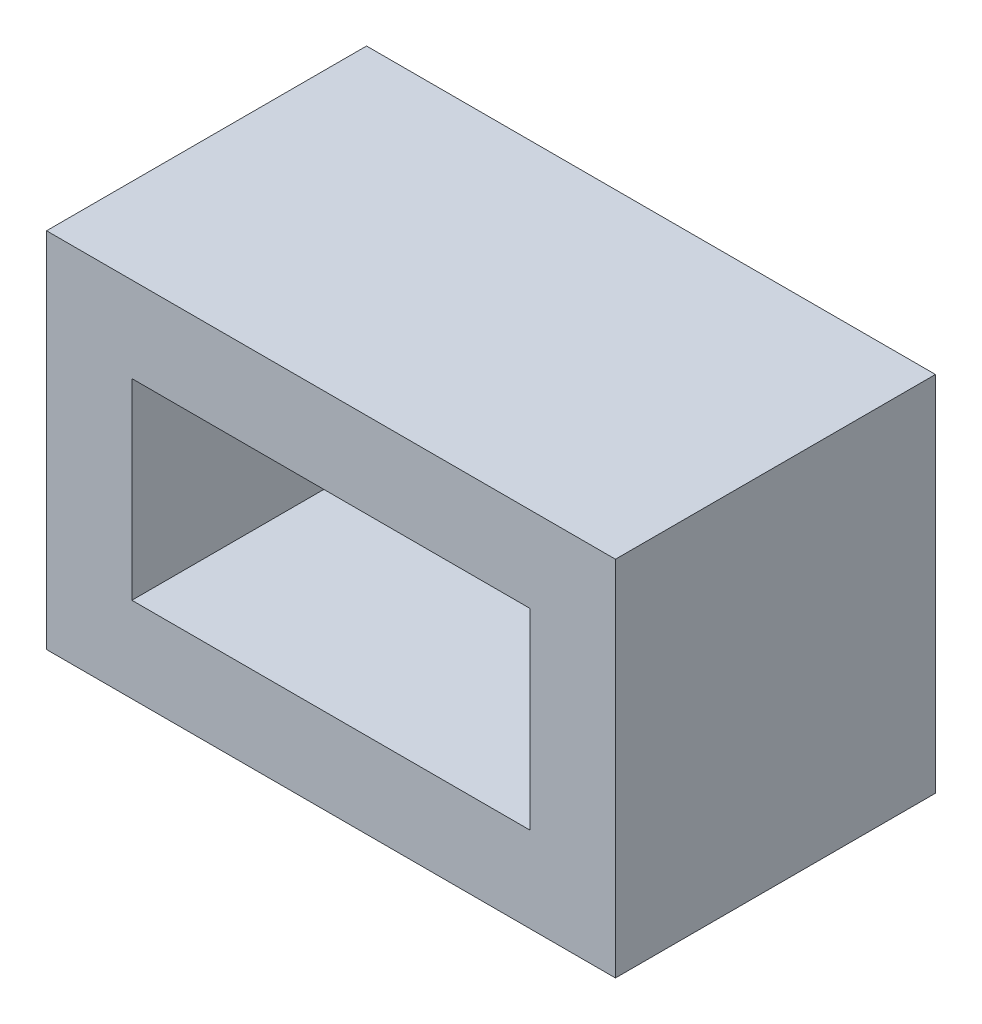
ISO-10303-21;
HEADER;
FILE_DESCRIPTION(('STEP AP214'),'2;1');
FILE_NAME('part.step','',(''),(''),'','','');
FILE_SCHEMA(('AUTOMOTIVE_DESIGN { 1 0 10303 214 1 1 1 1 }'));
ENDSEC;
DATA;
#1=APPLICATION_CONTEXT('core data for automotive mechanical design processes');
#2=APPLICATION_PROTOCOL_DEFINITION('international standard','automotive_design',2000,#1);
#3=PRODUCT_CONTEXT('',#1,'mechanical');
#4=PRODUCT('Part','Part','',(#3));
#5=PRODUCT_RELATED_PRODUCT_CATEGORY('part','',(#4));
#6=PRODUCT_DEFINITION_FORMATION('','',#4);
#7=PRODUCT_DEFINITION_CONTEXT('part definition',#1,'design');
#8=PRODUCT_DEFINITION('design','',#6,#7);
#9=PRODUCT_DEFINITION_SHAPE('','',#8);
#10=(LENGTH_UNIT() NAMED_UNIT(*) SI_UNIT(.MILLI.,.METRE.));
#11=(NAMED_UNIT(*) PLANE_ANGLE_UNIT() SI_UNIT($,.RADIAN.));
#12=(NAMED_UNIT(*) SI_UNIT($,.STERADIAN.) SOLID_ANGLE_UNIT());
#13=UNCERTAINTY_MEASURE_WITH_UNIT(LENGTH_MEASURE(1.E-05),#10,'distance_accuracy_value','');
#14=(GEOMETRIC_REPRESENTATION_CONTEXT(3) GLOBAL_UNCERTAINTY_ASSIGNED_CONTEXT((#13)) GLOBAL_UNIT_ASSIGNED_CONTEXT((#10,
#11,#12)) REPRESENTATION_CONTEXT('',''));
#15=CARTESIAN_POINT('',(0.,0.,0.));
#16=DIRECTION('',(0.,0.,1.));
#17=DIRECTION('',(1.,0.,0.));
#18=AXIS2_PLACEMENT_3D('',#15,#16,#17);
#19=CARTESIAN_POINT('',(21.,1.65924554587383,-37.));
#20=DIRECTION('',(0.,0.,1.));
#21=DIRECTION('',(1.,0.,0.));
#22=AXIS2_PLACEMENT_3D('',#19,#20,#21);
#23=PLANE('',#22);
#24=DIRECTION('',(0.,1.,0.));
#25=VECTOR('',#24,1.);
#26=CARTESIAN_POINT('',(18.2,0.309245545873832,-37.));
#27=LINE('',#26,#25);
#28=CARTESIAN_POINT('',(18.2,0.309245545873832,-37.));
#29=VERTEX_POINT('',#28);
#30=CARTESIAN_POINT('',(18.2,3.00924554587383,-37.));
#31=VERTEX_POINT('',#30);
#32=EDGE_CURVE('E165',#29,#31,#27,.T.);
#33=ORIENTED_EDGE('',*,*,#32,.T.);
#34=DIRECTION('',(1.,0.,0.));
#35=VECTOR('',#34,1.);
#36=CARTESIAN_POINT('',(23.8,3.00924554587383,-37.));
#37=LINE('',#36,#35);
#38=CARTESIAN_POINT('',(23.8,3.00924554587383,-37.));
#39=VERTEX_POINT('',#38);
#40=EDGE_CURVE('E175',#31,#39,#37,.T.);
#41=ORIENTED_EDGE('',*,*,#40,.T.);
#42=DIRECTION('',(0.,-1.,0.));
#43=VECTOR('',#42,1.);
#44=CARTESIAN_POINT('',(23.8,0.309245545873832,-37.));
#45=LINE('',#44,#43);
#46=CARTESIAN_POINT('',(23.8,0.309245545873832,-37.));
#47=VERTEX_POINT('',#46);
#48=EDGE_CURVE('E176',#39,#47,#45,.T.);
#49=ORIENTED_EDGE('',*,*,#48,.T.);
#50=DIRECTION('',(-1.,0.,0.));
#51=VECTOR('',#50,1.);
#52=CARTESIAN_POINT('',(18.2,0.309245545873832,-37.));
#53=LINE('',#52,#51);
#54=EDGE_CURVE('E135',#47,#29,#53,.T.);
#55=ORIENTED_EDGE('',*,*,#54,.T.);
#56=EDGE_LOOP('',(#33,#41,#49,#55));
#57=FACE_BOUND('',#56,.T.);
#58=DIRECTION('',(0.,-1.,0.));
#59=VECTOR('',#58,1.);
#60=CARTESIAN_POINT('',(17.,-0.890754454126168,-37.));
#61=LINE('',#60,#59);
#62=CARTESIAN_POINT('',(17.,4.20924554587383,-37.));
#63=VERTEX_POINT('',#62);
#64=CARTESIAN_POINT('',(17.,-0.890754454126168,-37.));
#65=VERTEX_POINT('',#64);
#66=EDGE_CURVE('E181',#63,#65,#61,.T.);
#67=ORIENTED_EDGE('',*,*,#66,.T.);
#68=DIRECTION('',(1.,0.,0.));
#69=VECTOR('',#68,1.);
#70=CARTESIAN_POINT('',(17.,-0.890754454126168,-37.));
#71=LINE('',#70,#69);
#72=CARTESIAN_POINT('',(25.,-0.890754454126168,-37.));
#73=VERTEX_POINT('',#72);
#74=EDGE_CURVE('E11',#65,#73,#71,.T.);
#75=ORIENTED_EDGE('',*,*,#74,.T.);
#76=DIRECTION('',(0.,1.,0.));
#77=VECTOR('',#76,1.);
#78=CARTESIAN_POINT('',(25.,-0.890754454126168,-37.));
#79=LINE('',#78,#77);
#80=CARTESIAN_POINT('',(25.,4.20924554587383,-37.));
#81=VERTEX_POINT('',#80);
#82=EDGE_CURVE('E179',#73,#81,#79,.T.);
#83=ORIENTED_EDGE('',*,*,#82,.T.);
#84=DIRECTION('',(-1.,0.,0.));
#85=VECTOR('',#84,1.);
#86=CARTESIAN_POINT('',(25.,4.20924554587383,-37.));
#87=LINE('',#86,#85);
#88=EDGE_CURVE('E164',#81,#63,#87,.T.);
#89=ORIENTED_EDGE('',*,*,#88,.T.);
#90=EDGE_LOOP('',(#67,#75,#83,#89));
#91=FACE_BOUND('',#90,.T.);
#92=ADVANCED_FACE('F17',(#57,#91),#23,.T.);
#93=CARTESIAN_POINT('',(17.,-0.890754454126168,-42.));
#94=DIRECTION('',(0.,-1.,0.));
#95=DIRECTION('',(0.,0.,-1.));
#96=AXIS2_PLACEMENT_3D('',#93,#94,#95);
#97=PLANE('',#96);
#98=DIRECTION('',(1.,0.,0.));
#99=VECTOR('',#98,1.);
#100=CARTESIAN_POINT('',(19.,-0.890754454126168,-41.5));
#101=LINE('',#100,#99);
#102=CARTESIAN_POINT('',(17.,-0.890754454126168,-41.5));
#103=VERTEX_POINT('',#102);
#104=CARTESIAN_POINT('',(25.,-0.890754454126168,-41.5));
#105=VERTEX_POINT('',#104);
#106=EDGE_CURVE('E158',#103,#105,#101,.T.);
#107=ORIENTED_EDGE('',*,*,#106,.T.);
#108=DIRECTION('',(0.,0.,1.));
#109=VECTOR('',#108,1.);
#110=CARTESIAN_POINT('',(25.,-0.890754454126168,-42.));
#111=LINE('',#110,#109);
#112=EDGE_CURVE('E28',#105,#73,#111,.T.);
#113=ORIENTED_EDGE('',*,*,#112,.T.);
#114=ORIENTED_EDGE('',*,*,#74,.F.);
#115=DIRECTION('',(0.,0.,1.));
#116=VECTOR('',#115,1.);
#117=CARTESIAN_POINT('',(17.,-0.890754454126168,-42.));
#118=LINE('',#117,#116);
#119=EDGE_CURVE('E21',#103,#65,#118,.T.);
#120=ORIENTED_EDGE('',*,*,#119,.F.);
#121=EDGE_LOOP('',(#107,#113,#114,#120));
#122=FACE_BOUND('',#121,.T.);
#123=ADVANCED_FACE('F233',(#122),#97,.T.);
#124=CARTESIAN_POINT('',(25.,-0.890754454126168,-42.));
#125=DIRECTION('',(1.,0.,0.));
#126=DIRECTION('',(0.,1.,0.));
#127=AXIS2_PLACEMENT_3D('',#124,#125,#126);
#128=PLANE('',#127);
#129=DIRECTION('',(0.,1.,0.));
#130=VECTOR('',#129,1.);
#131=CARTESIAN_POINT('',(25.,0.384245545873832,-41.5));
#132=LINE('',#131,#130);
#133=CARTESIAN_POINT('',(25.,4.20924554587383,-41.5));
#134=VERTEX_POINT('',#133);
#135=EDGE_CURVE('E169',#105,#134,#132,.T.);
#136=ORIENTED_EDGE('',*,*,#135,.T.);
#137=DIRECTION('',(0.,0.,1.));
#138=VECTOR('',#137,1.);
#139=CARTESIAN_POINT('',(25.,4.20924554587383,-42.));
#140=LINE('',#139,#138);
#141=EDGE_CURVE('E80',#134,#81,#140,.T.);
#142=ORIENTED_EDGE('',*,*,#141,.T.);
#143=ORIENTED_EDGE('',*,*,#82,.F.);
#144=ORIENTED_EDGE('',*,*,#112,.F.);
#145=EDGE_LOOP('',(#136,#142,#143,#144));
#146=FACE_BOUND('',#145,.T.);
#147=ADVANCED_FACE('F223',(#146),#128,.T.);
#148=CARTESIAN_POINT('',(18.2,3.00924554587383,-42.));
#149=DIRECTION('',(0.,-1.,0.));
#150=DIRECTION('',(0.,0.,-1.));
#151=AXIS2_PLACEMENT_3D('',#148,#149,#150);
#152=PLANE('',#151);
#153=DIRECTION('',(1.,0.,0.));
#154=VECTOR('',#153,1.);
#155=CARTESIAN_POINT('',(19.6,3.00924554587383,-41.5));
#156=LINE('',#155,#154);
#157=CARTESIAN_POINT('',(18.2,3.00924554587383,-41.5));
#158=VERTEX_POINT('',#157);
#159=CARTESIAN_POINT('',(23.8,3.00924554587383,-41.5));
#160=VERTEX_POINT('',#159);
#161=EDGE_CURVE('E147',#158,#160,#156,.T.);
#162=ORIENTED_EDGE('',*,*,#161,.T.);
#163=DIRECTION('',(0.,0.,1.));
#164=VECTOR('',#163,1.);
#165=CARTESIAN_POINT('',(23.8,3.00924554587383,-42.));
#166=LINE('',#165,#164);
#167=EDGE_CURVE('E144',#160,#39,#166,.T.);
#168=ORIENTED_EDGE('',*,*,#167,.T.);
#169=ORIENTED_EDGE('',*,*,#40,.F.);
#170=DIRECTION('',(0.,0.,1.));
#171=VECTOR('',#170,1.);
#172=CARTESIAN_POINT('',(18.2,3.00924554587383,-42.));
#173=LINE('',#172,#171);
#174=EDGE_CURVE('E120',#158,#31,#173,.T.);
#175=ORIENTED_EDGE('',*,*,#174,.F.);
#176=EDGE_LOOP('',(#162,#168,#169,#175));
#177=FACE_BOUND('',#176,.T.);
#178=ADVANCED_FACE('F221',(#177),#152,.T.);
#179=CARTESIAN_POINT('',(23.8,3.00924554587383,-42.));
#180=DIRECTION('',(-1.,0.,0.));
#181=DIRECTION('',(0.,0.,1.));
#182=AXIS2_PLACEMENT_3D('',#179,#180,#181);
#183=PLANE('',#182);
#184=DIRECTION('',(0.,-1.,0.));
#185=VECTOR('',#184,1.);
#186=CARTESIAN_POINT('',(23.8,2.33424554587383,-41.5));
#187=LINE('',#186,#185);
#188=CARTESIAN_POINT('',(23.8,0.309245545873832,-41.5));
#189=VERTEX_POINT('',#188);
#190=EDGE_CURVE('E141',#160,#189,#187,.T.);
#191=ORIENTED_EDGE('',*,*,#190,.T.);
#192=DIRECTION('',(0.,0.,1.));
#193=VECTOR('',#192,1.);
#194=CARTESIAN_POINT('',(23.8,0.309245545873832,-42.));
#195=LINE('',#194,#193);
#196=EDGE_CURVE('E128',#189,#47,#195,.T.);
#197=ORIENTED_EDGE('',*,*,#196,.T.);
#198=ORIENTED_EDGE('',*,*,#48,.F.);
#199=ORIENTED_EDGE('',*,*,#167,.F.);
#200=EDGE_LOOP('',(#191,#197,#198,#199));
#201=FACE_BOUND('',#200,.T.);
#202=ADVANCED_FACE('F142',(#201),#183,.T.);
#203=CARTESIAN_POINT('',(17.,4.20924554587383,-42.));
#204=DIRECTION('',(-1.,0.,0.));
#205=DIRECTION('',(0.,0.,1.));
#206=AXIS2_PLACEMENT_3D('',#203,#204,#205);
#207=PLANE('',#206);
#208=DIRECTION('',(0.,-1.,0.));
#209=VECTOR('',#208,1.);
#210=CARTESIAN_POINT('',(17.,2.93424554587383,-41.5));
#211=LINE('',#210,#209);
#212=CARTESIAN_POINT('',(17.,4.20924554587383,-41.5));
#213=VERTEX_POINT('',#212);
#214=EDGE_CURVE('E204',#213,#103,#211,.T.);
#215=ORIENTED_EDGE('',*,*,#214,.T.);
#216=ORIENTED_EDGE('',*,*,#119,.T.);
#217=ORIENTED_EDGE('',*,*,#66,.F.);
#218=DIRECTION('',(0.,0.,1.));
#219=VECTOR('',#218,1.);
#220=CARTESIAN_POINT('',(17.,4.20924554587383,-42.));
#221=LINE('',#220,#219);
#222=EDGE_CURVE('E60',#213,#63,#221,.T.);
#223=ORIENTED_EDGE('',*,*,#222,.F.);
#224=EDGE_LOOP('',(#215,#216,#217,#223));
#225=FACE_BOUND('',#224,.T.);
#226=ADVANCED_FACE('F231',(#225),#207,.T.);
#227=CARTESIAN_POINT('',(25.,4.20924554587383,-42.));
#228=DIRECTION('',(0.,1.,0.));
#229=DIRECTION('',(1.,0.,0.));
#230=AXIS2_PLACEMENT_3D('',#227,#228,#229);
#231=PLANE('',#230);
#232=DIRECTION('',(-1.,0.,0.));
#233=VECTOR('',#232,1.);
#234=CARTESIAN_POINT('',(23.,4.20924554587383,-41.5));
#235=LINE('',#234,#233);
#236=EDGE_CURVE('E172',#134,#213,#235,.T.);
#237=ORIENTED_EDGE('',*,*,#236,.T.);
#238=ORIENTED_EDGE('',*,*,#222,.T.);
#239=ORIENTED_EDGE('',*,*,#88,.F.);
#240=ORIENTED_EDGE('',*,*,#141,.F.);
#241=EDGE_LOOP('',(#237,#238,#239,#240));
#242=FACE_BOUND('',#241,.T.);
#243=ADVANCED_FACE('F19',(#242),#231,.T.);
#244=CARTESIAN_POINT('',(18.2,0.309245545873832,-42.));
#245=DIRECTION('',(1.,0.,0.));
#246=DIRECTION('',(0.,1.,0.));
#247=AXIS2_PLACEMENT_3D('',#244,#245,#246);
#248=PLANE('',#247);
#249=DIRECTION('',(0.,1.,0.));
#250=VECTOR('',#249,1.);
#251=CARTESIAN_POINT('',(18.2,0.984245545873832,-41.5));
#252=LINE('',#251,#250);
#253=CARTESIAN_POINT('',(18.2,0.309245545873832,-41.5));
#254=VERTEX_POINT('',#253);
#255=EDGE_CURVE('E151',#254,#158,#252,.T.);
#256=ORIENTED_EDGE('',*,*,#255,.T.);
#257=ORIENTED_EDGE('',*,*,#174,.T.);
#258=ORIENTED_EDGE('',*,*,#32,.F.);
#259=DIRECTION('',(0.,0.,1.));
#260=VECTOR('',#259,1.);
#261=CARTESIAN_POINT('',(18.2,0.309245545873832,-42.));
#262=LINE('',#261,#260);
#263=EDGE_CURVE('E113',#254,#29,#262,.T.);
#264=ORIENTED_EDGE('',*,*,#263,.F.);
#265=EDGE_LOOP('',(#256,#257,#258,#264));
#266=FACE_BOUND('',#265,.T.);
#267=ADVANCED_FACE('F220',(#266),#248,.T.);
#268=CARTESIAN_POINT('',(23.8,0.309245545873832,-42.));
#269=DIRECTION('',(0.,1.,0.));
#270=DIRECTION('',(1.,0.,0.));
#271=AXIS2_PLACEMENT_3D('',#268,#269,#270);
#272=PLANE('',#271);
#273=DIRECTION('',(-1.,0.,0.));
#274=VECTOR('',#273,1.);
#275=CARTESIAN_POINT('',(22.4,0.309245545873832,-41.5));
#276=LINE('',#275,#274);
#277=EDGE_CURVE('E132',#189,#254,#276,.T.);
#278=ORIENTED_EDGE('',*,*,#277,.T.);
#279=ORIENTED_EDGE('',*,*,#263,.T.);
#280=ORIENTED_EDGE('',*,*,#54,.F.);
#281=ORIENTED_EDGE('',*,*,#196,.F.);
#282=EDGE_LOOP('',(#278,#279,#280,#281));
#283=FACE_BOUND('',#282,.T.);
#284=ADVANCED_FACE('F130',(#283),#272,.T.);
#285=CARTESIAN_POINT('',(21.,1.65924554587383,-41.5));
#286=DIRECTION('',(0.,0.,1.));
#287=DIRECTION('',(1.,0.,0.));
#288=AXIS2_PLACEMENT_3D('',#285,#286,#287);
#289=PLANE('',#288);
#290=ORIENTED_EDGE('',*,*,#255,.F.);
#291=ORIENTED_EDGE('',*,*,#277,.F.);
#292=ORIENTED_EDGE('',*,*,#190,.F.);
#293=ORIENTED_EDGE('',*,*,#161,.F.);
#294=EDGE_LOOP('',(#290,#291,#292,#293));
#295=FACE_BOUND('',#294,.T.);
#296=ORIENTED_EDGE('',*,*,#214,.F.);
#297=ORIENTED_EDGE('',*,*,#236,.F.);
#298=ORIENTED_EDGE('',*,*,#135,.F.);
#299=ORIENTED_EDGE('',*,*,#106,.F.);
#300=EDGE_LOOP('',(#296,#297,#298,#299));
#301=FACE_BOUND('',#300,.T.);
#302=ADVANCED_FACE('F149',(#295,#301),#289,.F.);
#303=CLOSED_SHELL('',(#92,#123,#147,#178,#202,#226,#243,#267,#284,#302));
#304=MANIFOLD_SOLID_BREP('B1',#303);
#305=ADVANCED_BREP_SHAPE_REPRESENTATION('',(#18,#304),#14);
#306=SHAPE_DEFINITION_REPRESENTATION(#9,#305);
ENDSEC;
END-ISO-10303-21;
